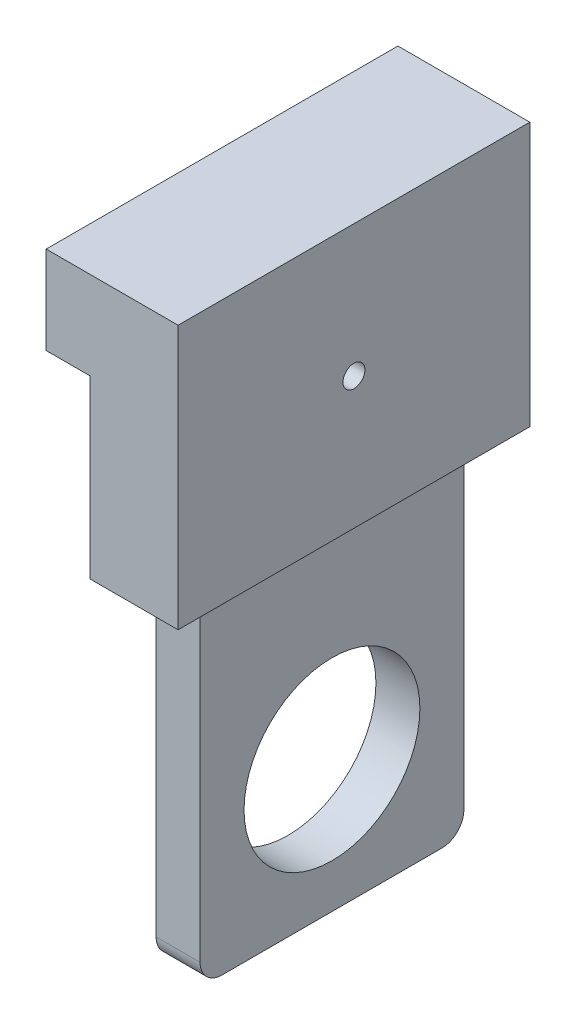
ISO-10303-21;
HEADER;
FILE_DESCRIPTION(('STEP AP214'),'2;1');
FILE_NAME('part.step','',(''),(''),'','','');
FILE_SCHEMA(('AUTOMOTIVE_DESIGN { 1 0 10303 214 1 1 1 1 }'));
ENDSEC;
DATA;
#1=APPLICATION_CONTEXT('core data for automotive mechanical design processes');
#2=APPLICATION_PROTOCOL_DEFINITION('international standard','automotive_design',2000,#1);
#3=PRODUCT_CONTEXT('',#1,'mechanical');
#4=PRODUCT('Part','Part','',(#3));
#5=PRODUCT_RELATED_PRODUCT_CATEGORY('part','',(#4));
#6=PRODUCT_DEFINITION_FORMATION('','',#4);
#7=PRODUCT_DEFINITION_CONTEXT('part definition',#1,'design');
#8=PRODUCT_DEFINITION('design','',#6,#7);
#9=PRODUCT_DEFINITION_SHAPE('','',#8);
#10=(LENGTH_UNIT() NAMED_UNIT(*) SI_UNIT(.MILLI.,.METRE.));
#11=(NAMED_UNIT(*) PLANE_ANGLE_UNIT() SI_UNIT($,.RADIAN.));
#12=(NAMED_UNIT(*) SI_UNIT($,.STERADIAN.) SOLID_ANGLE_UNIT());
#13=UNCERTAINTY_MEASURE_WITH_UNIT(LENGTH_MEASURE(1.E-05),#10,'distance_accuracy_value','');
#14=(GEOMETRIC_REPRESENTATION_CONTEXT(3) GLOBAL_UNCERTAINTY_ASSIGNED_CONTEXT((#13)) GLOBAL_UNIT_ASSIGNED_CONTEXT((#10,
#11,#12)) REPRESENTATION_CONTEXT('',''));
#15=CARTESIAN_POINT('',(0.,0.,0.));
#16=DIRECTION('',(0.,0.,1.));
#17=DIRECTION('',(1.,0.,0.));
#18=AXIS2_PLACEMENT_3D('',#15,#16,#17);
#19=CARTESIAN_POINT('',(0.,0.,0.));
#20=DIRECTION('',(0.,1.,0.));
#21=DIRECTION('',(0.,0.,1.));
#22=AXIS2_PLACEMENT_3D('',#19,#20,#21);
#23=PLANE('',#22);
#24=DIRECTION('',(0.,0.,-1.));
#25=VECTOR('',#24,1.);
#26=CARTESIAN_POINT('',(0.499999999999994,0.,2.00000000000001));
#27=LINE('',#26,#25);
#28=CARTESIAN_POINT('',(0.499999999999994,0.,-1.75));
#29=VERTEX_POINT('',#28);
#30=CARTESIAN_POINT('',(0.499999999999994,0.,-1.99999999999999));
#31=VERTEX_POINT('',#30);
#32=EDGE_CURVE('E58',#29,#31,#27,.T.);
#33=ORIENTED_EDGE('',*,*,#32,.F.);
#34=DIRECTION('',(1.,0.,0.));
#35=VECTOR('',#34,1.);
#36=CARTESIAN_POINT('',(-0.25,0.,-1.75));
#37=LINE('',#36,#35);
#38=CARTESIAN_POINT('',(-0.500000000000007,0.,-1.75));
#39=VERTEX_POINT('',#38);
#40=EDGE_CURVE('E245',#29,#39,#37,.F.);
#41=ORIENTED_EDGE('',*,*,#40,.T.);
#42=DIRECTION('',(0.,0.,-1.));
#43=VECTOR('',#42,1.);
#44=CARTESIAN_POINT('',(-0.500000000000007,0.,2.00000000000001));
#45=LINE('',#44,#43);
#46=CARTESIAN_POINT('',(-0.500000000000007,0.,-1.99999999999999));
#47=VERTEX_POINT('',#46);
#48=EDGE_CURVE('E206',#39,#47,#45,.T.);
#49=ORIENTED_EDGE('',*,*,#48,.T.);
#50=DIRECTION('',(1.,0.,0.));
#51=VECTOR('',#50,1.);
#52=CARTESIAN_POINT('',(-0.500000000000007,0.,-1.99999999999999));
#53=LINE('',#52,#51);
#54=EDGE_CURVE('E203',#47,#31,#53,.T.);
#55=ORIENTED_EDGE('',*,*,#54,.T.);
#56=EDGE_LOOP('',(#33,#41,#49,#55));
#57=FACE_BOUND('',#56,.T.);
#58=ADVANCED_FACE('F33',(#57),#23,.F.);
#59=CARTESIAN_POINT('',(-0.500000000000007,0.,2.00000000000001));
#60=VERTEX_POINT('',#59);
#61=CARTESIAN_POINT('',(-0.500000000000007,0.,1.75));
#62=VERTEX_POINT('',#61);
#63=EDGE_CURVE('E193',#60,#62,#45,.T.);
#64=ORIENTED_EDGE('',*,*,#63,.T.);
#65=DIRECTION('',(-1.,0.,0.));
#66=VECTOR('',#65,1.);
#67=CARTESIAN_POINT('',(0.25,0.,1.75));
#68=LINE('',#67,#66);
#69=CARTESIAN_POINT('',(0.499999999999994,0.,1.75));
#70=VERTEX_POINT('',#69);
#71=EDGE_CURVE('E243',#62,#70,#68,.F.);
#72=ORIENTED_EDGE('',*,*,#71,.T.);
#73=CARTESIAN_POINT('',(0.499999999999994,0.,2.00000000000001));
#74=VERTEX_POINT('',#73);
#75=EDGE_CURVE('E200',#74,#70,#27,.T.);
#76=ORIENTED_EDGE('',*,*,#75,.F.);
#77=DIRECTION('',(1.,0.,0.));
#78=VECTOR('',#77,1.);
#79=CARTESIAN_POINT('',(-0.500000000000007,0.,2.00000000000001));
#80=LINE('',#79,#78);
#81=EDGE_CURVE('E188',#60,#74,#80,.T.);
#82=ORIENTED_EDGE('',*,*,#81,.F.);
#83=EDGE_LOOP('',(#64,#72,#76,#82));
#84=FACE_BOUND('',#83,.T.);
#85=ADVANCED_FACE('F317',(#84),#23,.F.);
#86=CARTESIAN_POINT('',(-0.500000000000007,3.,2.00000000000001));
#87=DIRECTION('',(0.,0.,-1.));
#88=DIRECTION('',(-1.,0.,0.));
#89=AXIS2_PLACEMENT_3D('',#86,#87,#88);
#90=PLANE('',#89);
#91=ORIENTED_EDGE('',*,*,#81,.T.);
#92=DIRECTION('',(0.,-1.,0.));
#93=VECTOR('',#92,1.);
#94=CARTESIAN_POINT('',(0.499999999999994,3.,2.00000000000001));
#95=LINE('',#94,#93);
#96=CARTESIAN_POINT('',(0.499999999999994,3.,2.00000000000001));
#97=VERTEX_POINT('',#96);
#98=EDGE_CURVE('E215',#97,#74,#95,.T.);
#99=ORIENTED_EDGE('',*,*,#98,.F.);
#100=DIRECTION('',(1.,0.,0.));
#101=VECTOR('',#100,1.);
#102=CARTESIAN_POINT('',(-0.500000000000007,3.,2.00000000000001));
#103=LINE('',#102,#101);
#104=CARTESIAN_POINT('',(-1.00000000000001,3.,2.00000000000001));
#105=VERTEX_POINT('',#104);
#106=EDGE_CURVE('E189',#105,#97,#103,.T.);
#107=ORIENTED_EDGE('',*,*,#106,.F.);
#108=DIRECTION('',(0.,1.,0.));
#109=VECTOR('',#108,1.);
#110=CARTESIAN_POINT('',(-1.00000000000001,3.,2.00000000000001));
#111=LINE('',#110,#109);
#112=CARTESIAN_POINT('',(-1.00000000000001,2.,2.00000000000001));
#113=VERTEX_POINT('',#112);
#114=EDGE_CURVE('E145',#113,#105,#111,.T.);
#115=ORIENTED_EDGE('',*,*,#114,.F.);
#116=DIRECTION('',(1.,0.,0.));
#117=VECTOR('',#116,1.);
#118=CARTESIAN_POINT('',(-1.00000000000001,2.,2.00000000000001));
#119=LINE('',#118,#117);
#120=CARTESIAN_POINT('',(-0.500000000000007,2.,2.00000000000001));
#121=VERTEX_POINT('',#120);
#122=EDGE_CURVE('E141',#113,#121,#119,.T.);
#123=ORIENTED_EDGE('',*,*,#122,.T.);
#124=DIRECTION('',(0.,-1.,0.));
#125=VECTOR('',#124,1.);
#126=CARTESIAN_POINT('',(-0.500000000000007,3.,2.00000000000001));
#127=LINE('',#126,#125);
#128=EDGE_CURVE('E197',#121,#60,#127,.T.);
#129=ORIENTED_EDGE('',*,*,#128,.T.);
#130=EDGE_LOOP('',(#91,#99,#107,#115,#123,#129));
#131=FACE_BOUND('',#130,.T.);
#132=ADVANCED_FACE('F322',(#131),#90,.F.);
#133=CARTESIAN_POINT('',(0.499999999999994,3.,2.00000000000001));
#134=DIRECTION('',(-1.,0.,0.));
#135=DIRECTION('',(0.,0.,1.));
#136=AXIS2_PLACEMENT_3D('',#133,#134,#135);
#137=PLANE('',#136);
#138=CARTESIAN_POINT('',(0.499999999999994,1.5,0.));
#139=DIRECTION('',(1.,0.,0.));
#140=DIRECTION('',(0.,0.,-1.));
#141=AXIS2_PLACEMENT_3D('',#138,#139,#140);
#142=CIRCLE('',#141,0.125);
#143=CARTESIAN_POINT('',(0.499999999999994,1.5,-0.125));
#144=VERTEX_POINT('',#143);
#145=EDGE_CURVE('E509',#144,#144,#142,.T.);
#146=ORIENTED_EDGE('',*,*,#145,.F.);
#147=EDGE_LOOP('',(#146));
#148=FACE_BOUND('',#147,.T.);
#149=ORIENTED_EDGE('',*,*,#75,.T.);
#150=EDGE_CURVE('E204',#70,#29,#27,.T.);
#151=ORIENTED_EDGE('',*,*,#150,.T.);
#152=ORIENTED_EDGE('',*,*,#32,.T.);
#153=DIRECTION('',(0.,-1.,0.));
#154=VECTOR('',#153,1.);
#155=CARTESIAN_POINT('',(0.499999999999994,3.,-1.99999999999999));
#156=LINE('',#155,#154);
#157=CARTESIAN_POINT('',(0.499999999999994,3.,-1.99999999999999));
#158=VERTEX_POINT('',#157);
#159=EDGE_CURVE('E212',#158,#31,#156,.T.);
#160=ORIENTED_EDGE('',*,*,#159,.F.);
#161=DIRECTION('',(0.,0.,-1.));
#162=VECTOR('',#161,1.);
#163=CARTESIAN_POINT('',(0.499999999999994,3.,2.00000000000001));
#164=LINE('',#163,#162);
#165=EDGE_CURVE('E192',#97,#158,#164,.T.);
#166=ORIENTED_EDGE('',*,*,#165,.F.);
#167=ORIENTED_EDGE('',*,*,#98,.T.);
#168=EDGE_LOOP('',(#149,#151,#152,#160,#166,#167));
#169=FACE_BOUND('',#168,.T.);
#170=ADVANCED_FACE('F268',(#148,#169),#137,.F.);
#171=CARTESIAN_POINT('',(-0.500000000000007,3.,-1.99999999999999));
#172=DIRECTION('',(0.,0.,-1.));
#173=DIRECTION('',(-1.,0.,0.));
#174=AXIS2_PLACEMENT_3D('',#171,#172,#173);
#175=PLANE('',#174);
#176=ORIENTED_EDGE('',*,*,#54,.F.);
#177=DIRECTION('',(0.,-1.,0.));
#178=VECTOR('',#177,1.);
#179=CARTESIAN_POINT('',(-0.500000000000007,3.,-1.99999999999999));
#180=LINE('',#179,#178);
#181=CARTESIAN_POINT('',(-0.500000000000007,2.,-1.99999999999999));
#182=VERTEX_POINT('',#181);
#183=EDGE_CURVE('E158',#182,#47,#180,.T.);
#184=ORIENTED_EDGE('',*,*,#183,.F.);
#185=DIRECTION('',(1.,0.,0.));
#186=VECTOR('',#185,1.);
#187=CARTESIAN_POINT('',(-1.00000000000001,2.,-1.99999999999999));
#188=LINE('',#187,#186);
#189=CARTESIAN_POINT('',(-1.00000000000001,2.,-1.99999999999999));
#190=VERTEX_POINT('',#189);
#191=EDGE_CURVE('E139',#190,#182,#188,.T.);
#192=ORIENTED_EDGE('',*,*,#191,.F.);
#193=DIRECTION('',(0.,-1.,0.));
#194=VECTOR('',#193,1.);
#195=CARTESIAN_POINT('',(-1.00000000000001,3.,-1.99999999999999));
#196=LINE('',#195,#194);
#197=CARTESIAN_POINT('',(-1.00000000000001,3.,-1.99999999999999));
#198=VERTEX_POINT('',#197);
#199=EDGE_CURVE('E146',#198,#190,#196,.T.);
#200=ORIENTED_EDGE('',*,*,#199,.F.);
#201=DIRECTION('',(1.,0.,0.));
#202=VECTOR('',#201,1.);
#203=CARTESIAN_POINT('',(-0.500000000000007,3.,-1.99999999999999));
#204=LINE('',#203,#202);
#205=EDGE_CURVE('E195',#198,#158,#204,.T.);
#206=ORIENTED_EDGE('',*,*,#205,.T.);
#207=ORIENTED_EDGE('',*,*,#159,.T.);
#208=EDGE_LOOP('',(#176,#184,#192,#200,#206,#207));
#209=FACE_BOUND('',#208,.T.);
#210=ADVANCED_FACE('F157',(#209),#175,.T.);
#211=CARTESIAN_POINT('',(-0.500000000000007,3.,2.00000000000001));
#212=DIRECTION('',(-1.,0.,0.));
#213=DIRECTION('',(0.,0.,1.));
#214=AXIS2_PLACEMENT_3D('',#211,#212,#213);
#215=PLANE('',#214);
#216=CARTESIAN_POINT('',(-0.500000000000007,1.5,0.));
#217=DIRECTION('',(1.,0.,0.));
#218=DIRECTION('',(0.,0.,-1.));
#219=AXIS2_PLACEMENT_3D('',#216,#217,#218);
#220=CIRCLE('',#219,0.125);
#221=CARTESIAN_POINT('',(-0.500000000000007,1.5,-0.125));
#222=VERTEX_POINT('',#221);
#223=EDGE_CURVE('E506',#222,#222,#220,.T.);
#224=ORIENTED_EDGE('',*,*,#223,.T.);
#225=EDGE_LOOP('',(#224));
#226=FACE_BOUND('',#225,.T.);
#227=DIRECTION('',(0.,0.,1.));
#228=VECTOR('',#227,1.);
#229=CARTESIAN_POINT('',(-0.500000000000007,2.,-1.99999999999999));
#230=LINE('',#229,#228);
#231=EDGE_CURVE('E50',#182,#121,#230,.T.);
#232=ORIENTED_EDGE('',*,*,#231,.F.);
#233=ORIENTED_EDGE('',*,*,#183,.T.);
#234=ORIENTED_EDGE('',*,*,#48,.F.);
#235=EDGE_CURVE('E209',#62,#39,#45,.T.);
#236=ORIENTED_EDGE('',*,*,#235,.F.);
#237=ORIENTED_EDGE('',*,*,#63,.F.);
#238=ORIENTED_EDGE('',*,*,#128,.F.);
#239=EDGE_LOOP('',(#232,#233,#234,#236,#237,#238));
#240=FACE_BOUND('',#239,.T.);
#241=ADVANCED_FACE('F312',(#226,#240),#215,.T.);
#242=CARTESIAN_POINT('',(0.,3.,0.));
#243=DIRECTION('',(0.,1.,0.));
#244=DIRECTION('',(0.,0.,1.));
#245=AXIS2_PLACEMENT_3D('',#242,#243,#244);
#246=PLANE('',#245);
#247=ORIENTED_EDGE('',*,*,#106,.T.);
#248=ORIENTED_EDGE('',*,*,#165,.T.);
#249=ORIENTED_EDGE('',*,*,#205,.F.);
#250=DIRECTION('',(0.,0.,-1.));
#251=VECTOR('',#250,1.);
#252=CARTESIAN_POINT('',(-1.00000000000001,3.,-1.99999999999999));
#253=LINE('',#252,#251);
#254=EDGE_CURVE('E152',#105,#198,#253,.T.);
#255=ORIENTED_EDGE('',*,*,#254,.F.);
#256=EDGE_LOOP('',(#247,#248,#249,#255));
#257=FACE_BOUND('',#256,.T.);
#258=ADVANCED_FACE('F304',(#257),#246,.T.);
#259=CARTESIAN_POINT('',(0.25,-3.9,-1.5));
#260=DIRECTION('',(-1.,0.,0.));
#261=DIRECTION('',(0.,0.,1.));
#262=AXIS2_PLACEMENT_3D('',#259,#260,#261);
#263=PLANE('',#262);
#264=CARTESIAN_POINT('',(0.25,-2.4,0.));
#265=DIRECTION('',(1.,0.,0.));
#266=DIRECTION('',(0.,0.,-1.));
#267=AXIS2_PLACEMENT_3D('',#264,#265,#266);
#268=CIRCLE('',#267,1.);
#269=CARTESIAN_POINT('',(0.25,-2.4,-1.));
#270=VERTEX_POINT('',#269);
#271=EDGE_CURVE('E166',#270,#270,#268,.T.);
#272=ORIENTED_EDGE('',*,*,#271,.F.);
#273=EDGE_LOOP('',(#272));
#274=FACE_BOUND('',#273,.T.);
#275=DIRECTION('',(0.,0.,1.));
#276=VECTOR('',#275,1.);
#277=CARTESIAN_POINT('',(0.25,-3.9,-1.5));
#278=LINE('',#277,#276);
#279=CARTESIAN_POINT('',(0.25,-3.9,-1.25));
#280=VERTEX_POINT('',#279);
#281=CARTESIAN_POINT('',(0.25,-3.9,1.25));
#282=VERTEX_POINT('',#281);
#283=EDGE_CURVE('E170',#280,#282,#278,.T.);
#284=ORIENTED_EDGE('',*,*,#283,.F.);
#285=CARTESIAN_POINT('',(0.25,-3.65,-1.25));
#286=DIRECTION('',(-1.,0.,0.));
#287=DIRECTION('',(0.,0.,1.));
#288=AXIS2_PLACEMENT_3D('',#285,#286,#287);
#289=CIRCLE('',#288,0.25);
#290=CARTESIAN_POINT('',(0.25,-3.65,-1.5));
#291=VERTEX_POINT('',#290);
#292=EDGE_CURVE('E230',#280,#291,#289,.F.);
#293=ORIENTED_EDGE('',*,*,#292,.T.);
#294=DIRECTION('',(0.,1.,0.));
#295=VECTOR('',#294,1.);
#296=CARTESIAN_POINT('',(0.25,-3.9,-1.5));
#297=LINE('',#296,#295);
#298=CARTESIAN_POINT('',(0.25,-0.25,-1.5));
#299=VERTEX_POINT('',#298);
#300=EDGE_CURVE('E176',#291,#299,#297,.T.);
#301=ORIENTED_EDGE('',*,*,#300,.T.);
#302=DIRECTION('',(0.,0.,1.));
#303=VECTOR('',#302,1.);
#304=CARTESIAN_POINT('',(0.25,-0.25,1.5));
#305=LINE('',#304,#303);
#306=CARTESIAN_POINT('',(0.25,-0.25,1.5));
#307=VERTEX_POINT('',#306);
#308=EDGE_CURVE('E228',#299,#307,#305,.T.);
#309=ORIENTED_EDGE('',*,*,#308,.T.);
#310=DIRECTION('',(0.,1.,0.));
#311=VECTOR('',#310,1.);
#312=CARTESIAN_POINT('',(0.25,-3.9,1.5));
#313=LINE('',#312,#311);
#314=CARTESIAN_POINT('',(0.25,-3.65,1.5));
#315=VERTEX_POINT('',#314);
#316=EDGE_CURVE('E185',#315,#307,#313,.T.);
#317=ORIENTED_EDGE('',*,*,#316,.F.);
#318=CARTESIAN_POINT('',(0.25,-3.65,1.25));
#319=DIRECTION('',(-1.,0.,0.));
#320=DIRECTION('',(0.,0.,1.));
#321=AXIS2_PLACEMENT_3D('',#318,#319,#320);
#322=CIRCLE('',#321,0.25);
#323=EDGE_CURVE('E226',#315,#282,#322,.F.);
#324=ORIENTED_EDGE('',*,*,#323,.T.);
#325=EDGE_LOOP('',(#284,#293,#301,#309,#317,#324));
#326=FACE_BOUND('',#325,.T.);
#327=ADVANCED_FACE('F302',(#274,#326),#263,.F.);
#328=CARTESIAN_POINT('',(-0.25,-3.9,1.5));
#329=DIRECTION('',(0.,0.,-1.));
#330=DIRECTION('',(-1.,0.,0.));
#331=AXIS2_PLACEMENT_3D('',#328,#329,#330);
#332=PLANE('',#331);
#333=ORIENTED_EDGE('',*,*,#316,.T.);
#334=DIRECTION('',(-1.,0.,0.));
#335=VECTOR('',#334,1.);
#336=CARTESIAN_POINT('',(-0.25,-0.25,1.5));
#337=LINE('',#336,#335);
#338=CARTESIAN_POINT('',(-0.25,-0.25,1.5));
#339=VERTEX_POINT('',#338);
#340=EDGE_CURVE('E11',#307,#339,#337,.T.);
#341=ORIENTED_EDGE('',*,*,#340,.T.);
#342=DIRECTION('',(0.,1.,0.));
#343=VECTOR('',#342,1.);
#344=CARTESIAN_POINT('',(-0.25,-3.9,1.5));
#345=LINE('',#344,#343);
#346=CARTESIAN_POINT('',(-0.25,-3.65,1.5));
#347=VERTEX_POINT('',#346);
#348=EDGE_CURVE('E182',#347,#339,#345,.T.);
#349=ORIENTED_EDGE('',*,*,#348,.F.);
#350=DIRECTION('',(-1.,0.,0.));
#351=VECTOR('',#350,1.);
#352=CARTESIAN_POINT('',(-0.25,-3.65,1.5));
#353=LINE('',#352,#351);
#354=EDGE_CURVE('E42',#347,#315,#353,.F.);
#355=ORIENTED_EDGE('',*,*,#354,.T.);
#356=EDGE_LOOP('',(#333,#341,#349,#355));
#357=FACE_BOUND('',#356,.T.);
#358=ADVANCED_FACE('F299',(#357),#332,.F.);
#359=CARTESIAN_POINT('',(-0.25,-3.9,-1.5));
#360=DIRECTION('',(1.,0.,0.));
#361=DIRECTION('',(0.,0.,-1.));
#362=AXIS2_PLACEMENT_3D('',#359,#360,#361);
#363=PLANE('',#362);
#364=CARTESIAN_POINT('',(-0.25,-2.4,0.));
#365=DIRECTION('',(1.,0.,0.));
#366=DIRECTION('',(0.,0.,-1.));
#367=AXIS2_PLACEMENT_3D('',#364,#365,#366);
#368=CIRCLE('',#367,1.);
#369=CARTESIAN_POINT('',(-0.25,-2.4,-1.));
#370=VERTEX_POINT('',#369);
#371=EDGE_CURVE('E169',#370,#370,#368,.T.);
#372=ORIENTED_EDGE('',*,*,#371,.T.);
#373=EDGE_LOOP('',(#372));
#374=FACE_BOUND('',#373,.T.);
#375=DIRECTION('',(0.,1.,0.));
#376=VECTOR('',#375,1.);
#377=CARTESIAN_POINT('',(-0.25,-3.9,-1.5));
#378=LINE('',#377,#376);
#379=CARTESIAN_POINT('',(-0.25,-3.65,-1.5));
#380=VERTEX_POINT('',#379);
#381=CARTESIAN_POINT('',(-0.25,-0.25,-1.5));
#382=VERTEX_POINT('',#381);
#383=EDGE_CURVE('E179',#380,#382,#378,.T.);
#384=ORIENTED_EDGE('',*,*,#383,.F.);
#385=CARTESIAN_POINT('',(-0.25,-3.65,-1.25));
#386=DIRECTION('',(1.,0.,0.));
#387=DIRECTION('',(0.,0.,-1.));
#388=AXIS2_PLACEMENT_3D('',#385,#386,#387);
#389=CIRCLE('',#388,0.25);
#390=CARTESIAN_POINT('',(-0.25,-3.9,-1.25));
#391=VERTEX_POINT('',#390);
#392=EDGE_CURVE('E241',#380,#391,#389,.F.);
#393=ORIENTED_EDGE('',*,*,#392,.T.);
#394=DIRECTION('',(0.,0.,-1.));
#395=VECTOR('',#394,1.);
#396=CARTESIAN_POINT('',(-0.25,-3.9,-1.5));
#397=LINE('',#396,#395);
#398=CARTESIAN_POINT('',(-0.25,-3.9,1.25));
#399=VERTEX_POINT('',#398);
#400=EDGE_CURVE('E173',#399,#391,#397,.T.);
#401=ORIENTED_EDGE('',*,*,#400,.F.);
#402=CARTESIAN_POINT('',(-0.25,-3.65,1.25));
#403=DIRECTION('',(1.,0.,0.));
#404=DIRECTION('',(0.,0.,-1.));
#405=AXIS2_PLACEMENT_3D('',#402,#403,#404);
#406=CIRCLE('',#405,0.25);
#407=EDGE_CURVE('E236',#399,#347,#406,.F.);
#408=ORIENTED_EDGE('',*,*,#407,.T.);
#409=ORIENTED_EDGE('',*,*,#348,.T.);
#410=DIRECTION('',(0.,0.,-1.));
#411=VECTOR('',#410,1.);
#412=CARTESIAN_POINT('',(-0.25,-0.25,-1.5));
#413=LINE('',#412,#411);
#414=EDGE_CURVE('E238',#339,#382,#413,.T.);
#415=ORIENTED_EDGE('',*,*,#414,.T.);
#416=EDGE_LOOP('',(#384,#393,#401,#408,#409,#415));
#417=FACE_BOUND('',#416,.T.);
#418=ADVANCED_FACE('F282',(#374,#417),#363,.F.);
#419=CARTESIAN_POINT('',(-0.25,-3.9,-1.5));
#420=DIRECTION('',(0.,0.,1.));
#421=DIRECTION('',(1.,0.,0.));
#422=AXIS2_PLACEMENT_3D('',#419,#420,#421);
#423=PLANE('',#422);
#424=ORIENTED_EDGE('',*,*,#300,.F.);
#425=DIRECTION('',(1.,0.,0.));
#426=VECTOR('',#425,1.);
#427=CARTESIAN_POINT('',(-0.25,-3.65,-1.5));
#428=LINE('',#427,#426);
#429=EDGE_CURVE('E234',#291,#380,#428,.F.);
#430=ORIENTED_EDGE('',*,*,#429,.T.);
#431=ORIENTED_EDGE('',*,*,#383,.T.);
#432=DIRECTION('',(1.,0.,0.));
#433=VECTOR('',#432,1.);
#434=CARTESIAN_POINT('',(0.25,-0.25,-1.5));
#435=LINE('',#434,#433);
#436=EDGE_CURVE('E232',#382,#299,#435,.T.);
#437=ORIENTED_EDGE('',*,*,#436,.T.);
#438=EDGE_LOOP('',(#424,#430,#431,#437));
#439=FACE_BOUND('',#438,.T.);
#440=ADVANCED_FACE('F285',(#439),#423,.F.);
#441=CARTESIAN_POINT('',(0.,-3.9,0.));
#442=DIRECTION('',(0.,1.,0.));
#443=DIRECTION('',(0.,0.,1.));
#444=AXIS2_PLACEMENT_3D('',#441,#442,#443);
#445=PLANE('',#444);
#446=ORIENTED_EDGE('',*,*,#400,.T.);
#447=DIRECTION('',(1.,0.,0.));
#448=VECTOR('',#447,1.);
#449=CARTESIAN_POINT('',(0.,-3.9,-1.25));
#450=LINE('',#449,#448);
#451=EDGE_CURVE('E223',#391,#280,#450,.T.);
#452=ORIENTED_EDGE('',*,*,#451,.T.);
#453=ORIENTED_EDGE('',*,*,#283,.T.);
#454=DIRECTION('',(-1.,0.,0.));
#455=VECTOR('',#454,1.);
#456=CARTESIAN_POINT('',(0.,-3.9,1.25));
#457=LINE('',#456,#455);
#458=EDGE_CURVE('E218',#282,#399,#457,.T.);
#459=ORIENTED_EDGE('',*,*,#458,.T.);
#460=EDGE_LOOP('',(#446,#452,#453,#459));
#461=FACE_BOUND('',#460,.T.);
#462=ADVANCED_FACE('F292',(#461),#445,.F.);
#463=CARTESIAN_POINT('',(-3.65,-2.4,0.));
#464=DIRECTION('',(1.,0.,0.));
#465=DIRECTION('',(0.,0.,-1.));
#466=AXIS2_PLACEMENT_3D('',#463,#464,#465);
#467=CYLINDRICAL_SURFACE('',#466,1.);
#468=ORIENTED_EDGE('',*,*,#271,.T.);
#469=EDGE_LOOP('',(#468));
#470=FACE_BOUND('',#469,.T.);
#471=ORIENTED_EDGE('',*,*,#371,.F.);
#472=EDGE_LOOP('',(#471));
#473=FACE_BOUND('',#472,.T.);
#474=ADVANCED_FACE('F338',(#470,#473),#467,.F.);
#475=CARTESIAN_POINT('',(0.,-3.65,-1.25));
#476=DIRECTION('',(1.,0.,0.));
#477=DIRECTION('',(0.,0.,-1.));
#478=AXIS2_PLACEMENT_3D('',#475,#476,#477);
#479=CYLINDRICAL_SURFACE('',#478,0.25);
#480=ORIENTED_EDGE('',*,*,#392,.F.);
#481=ORIENTED_EDGE('',*,*,#429,.F.);
#482=ORIENTED_EDGE('',*,*,#292,.F.);
#483=ORIENTED_EDGE('',*,*,#451,.F.);
#484=EDGE_LOOP('',(#480,#481,#482,#483));
#485=FACE_BOUND('',#484,.T.);
#486=ADVANCED_FACE('F288',(#485),#479,.T.);
#487=CARTESIAN_POINT('',(0.5,-0.25,-1.5));
#488=DIRECTION('',(0.,0.,-1.));
#489=DIRECTION('',(-1.,0.,0.));
#490=AXIS2_PLACEMENT_3D('',#487,#488,#489);
#491=CYLINDRICAL_SURFACE('',#490,0.25);
#492=CARTESIAN_POINT('',(0.5,-0.25,-1.75));
#493=DIRECTION('',(-0.707106781186547,0.,-0.707106781186548));
#494=DIRECTION('',(0.707106781186548,0.,-0.707106781186547));
#495=AXIS2_PLACEMENT_3D('',#492,#493,#494);
#496=ELLIPSE('',#495,0.353553390593274,0.25);
#497=EDGE_CURVE('E248',#29,#299,#496,.F.);
#498=ORIENTED_EDGE('',*,*,#497,.F.);
#499=ORIENTED_EDGE('',*,*,#150,.F.);
#500=CARTESIAN_POINT('',(0.5,-0.25,1.75));
#501=DIRECTION('',(0.707106781186547,0.,-0.707106781186547));
#502=DIRECTION('',(0.707106781186547,0.,0.707106781186547));
#503=AXIS2_PLACEMENT_3D('',#500,#501,#502);
#504=ELLIPSE('',#503,0.353553390593274,0.25);
#505=EDGE_CURVE('E37',#307,#70,#504,.T.);
#506=ORIENTED_EDGE('',*,*,#505,.F.);
#507=ORIENTED_EDGE('',*,*,#308,.F.);
#508=EDGE_LOOP('',(#498,#499,#506,#507));
#509=FACE_BOUND('',#508,.T.);
#510=ADVANCED_FACE('F265',(#509),#491,.F.);
#511=CARTESIAN_POINT('',(-0.25,-0.25,1.75));
#512=DIRECTION('',(1.,0.,0.));
#513=DIRECTION('',(0.,0.,-1.));
#514=AXIS2_PLACEMENT_3D('',#511,#512,#513);
#515=CYLINDRICAL_SURFACE('',#514,0.25);
#516=ORIENTED_EDGE('',*,*,#505,.T.);
#517=ORIENTED_EDGE('',*,*,#71,.F.);
#518=CARTESIAN_POINT('',(-0.5,-0.25,1.75));
#519=DIRECTION('',(0.707106781186547,0.,0.707106781186547));
#520=DIRECTION('',(0.707106781186547,0.,-0.707106781186547));
#521=AXIS2_PLACEMENT_3D('',#518,#519,#520);
#522=ELLIPSE('',#521,0.353553390593274,0.25);
#523=EDGE_CURVE('E161',#339,#62,#522,.T.);
#524=ORIENTED_EDGE('',*,*,#523,.F.);
#525=ORIENTED_EDGE('',*,*,#340,.F.);
#526=EDGE_LOOP('',(#516,#517,#524,#525));
#527=FACE_BOUND('',#526,.T.);
#528=ADVANCED_FACE('F259',(#527),#515,.F.);
#529=CARTESIAN_POINT('',(-0.25,-0.25,-1.75));
#530=DIRECTION('',(-1.,0.,0.));
#531=DIRECTION('',(0.,0.,1.));
#532=AXIS2_PLACEMENT_3D('',#529,#530,#531);
#533=CYLINDRICAL_SURFACE('',#532,0.25);
#534=ORIENTED_EDGE('',*,*,#497,.T.);
#535=ORIENTED_EDGE('',*,*,#436,.F.);
#536=CARTESIAN_POINT('',(-0.5,-0.25,-1.75));
#537=DIRECTION('',(-0.707106781186548,0.,0.707106781186547));
#538=DIRECTION('',(-0.707106781186547,0.,-0.707106781186548));
#539=AXIS2_PLACEMENT_3D('',#536,#537,#538);
#540=ELLIPSE('',#539,0.353553390593274,0.25);
#541=EDGE_CURVE('E159',#39,#382,#540,.F.);
#542=ORIENTED_EDGE('',*,*,#541,.F.);
#543=ORIENTED_EDGE('',*,*,#40,.F.);
#544=EDGE_LOOP('',(#534,#535,#542,#543));
#545=FACE_BOUND('',#544,.T.);
#546=ADVANCED_FACE('F277',(#545),#533,.F.);
#547=CARTESIAN_POINT('',(-0.5,-0.25,-1.5));
#548=DIRECTION('',(0.,0.,1.));
#549=DIRECTION('',(1.,0.,0.));
#550=AXIS2_PLACEMENT_3D('',#547,#548,#549);
#551=CYLINDRICAL_SURFACE('',#550,0.25);
#552=ORIENTED_EDGE('',*,*,#523,.T.);
#553=ORIENTED_EDGE('',*,*,#235,.T.);
#554=ORIENTED_EDGE('',*,*,#541,.T.);
#555=ORIENTED_EDGE('',*,*,#414,.F.);
#556=EDGE_LOOP('',(#552,#553,#554,#555));
#557=FACE_BOUND('',#556,.T.);
#558=ADVANCED_FACE('F274',(#557),#551,.F.);
#559=CARTESIAN_POINT('',(0.,-3.65,1.25));
#560=DIRECTION('',(-1.,0.,0.));
#561=DIRECTION('',(0.,0.,1.));
#562=AXIS2_PLACEMENT_3D('',#559,#560,#561);
#563=CYLINDRICAL_SURFACE('',#562,0.25);
#564=ORIENTED_EDGE('',*,*,#323,.F.);
#565=ORIENTED_EDGE('',*,*,#354,.F.);
#566=ORIENTED_EDGE('',*,*,#407,.F.);
#567=ORIENTED_EDGE('',*,*,#458,.F.);
#568=EDGE_LOOP('',(#564,#565,#566,#567));
#569=FACE_BOUND('',#568,.T.);
#570=ADVANCED_FACE('F35',(#569),#563,.T.);
#571=CARTESIAN_POINT('',(-1.00000000000001,2.,-1.99999999999999));
#572=DIRECTION('',(0.,1.,0.));
#573=DIRECTION('',(0.,0.,1.));
#574=AXIS2_PLACEMENT_3D('',#571,#572,#573);
#575=PLANE('',#574);
#576=ORIENTED_EDGE('',*,*,#231,.T.);
#577=ORIENTED_EDGE('',*,*,#122,.F.);
#578=DIRECTION('',(0.,0.,1.));
#579=VECTOR('',#578,1.);
#580=CARTESIAN_POINT('',(-1.00000000000001,2.,-1.99999999999999));
#581=LINE('',#580,#579);
#582=EDGE_CURVE('E135',#190,#113,#581,.T.);
#583=ORIENTED_EDGE('',*,*,#582,.F.);
#584=ORIENTED_EDGE('',*,*,#191,.T.);
#585=EDGE_LOOP('',(#576,#577,#583,#584));
#586=FACE_BOUND('',#585,.T.);
#587=ADVANCED_FACE('F137',(#586),#575,.F.);
#588=CARTESIAN_POINT('',(-1.00000000000001,0.,0.));
#589=DIRECTION('',(-1.,0.,0.));
#590=DIRECTION('',(0.,0.,1.));
#591=AXIS2_PLACEMENT_3D('',#588,#589,#590);
#592=PLANE('',#591);
#593=ORIENTED_EDGE('',*,*,#199,.T.);
#594=ORIENTED_EDGE('',*,*,#582,.T.);
#595=ORIENTED_EDGE('',*,*,#114,.T.);
#596=ORIENTED_EDGE('',*,*,#254,.T.);
#597=EDGE_LOOP('',(#593,#594,#595,#596));
#598=FACE_BOUND('',#597,.T.);
#599=ADVANCED_FACE('F150',(#598),#592,.T.);
#600=CARTESIAN_POINT('',(-0.500000000000007,1.5,0.));
#601=DIRECTION('',(1.,0.,0.));
#602=DIRECTION('',(0.,0.,-1.));
#603=AXIS2_PLACEMENT_3D('',#600,#601,#602);
#604=CYLINDRICAL_SURFACE('',#603,0.125);
#605=ORIENTED_EDGE('',*,*,#223,.F.);
#606=EDGE_LOOP('',(#605));
#607=FACE_BOUND('',#606,.T.);
#608=ORIENTED_EDGE('',*,*,#145,.T.);
#609=EDGE_LOOP('',(#608));
#610=FACE_BOUND('',#609,.T.);
#611=ADVANCED_FACE('F381',(#607,#610),#604,.F.);
#612=CLOSED_SHELL('',(#58,#85,#132,#170,#210,#241,#258,#327,#358,#418,#440,#462,#474,#486,#510,
#528,#546,#558,#570,#587,#599,#611));
#613=MANIFOLD_SOLID_BREP('B2',#612);
#614=ADVANCED_BREP_SHAPE_REPRESENTATION('',(#18,#613),#14);
#615=SHAPE_DEFINITION_REPRESENTATION(#9,#614);
ENDSEC;
END-ISO-10303-21;
